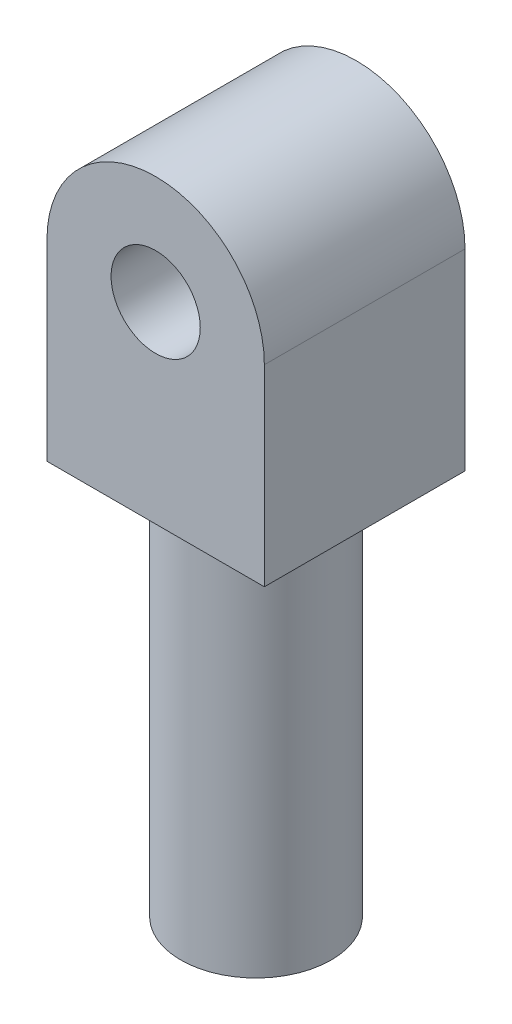
ISO-10303-21;
HEADER;
FILE_DESCRIPTION(('STEP AP214'),'2;1');
FILE_NAME('part.step','',(''),(''),'','','');
FILE_SCHEMA(('AUTOMOTIVE_DESIGN { 1 0 10303 214 1 1 1 1 }'));
ENDSEC;
DATA;
#1=APPLICATION_CONTEXT('core data for automotive mechanical design processes');
#2=APPLICATION_PROTOCOL_DEFINITION('international standard','automotive_design',2000,#1);
#3=PRODUCT_CONTEXT('',#1,'mechanical');
#4=PRODUCT('Part','Part','',(#3));
#5=PRODUCT_RELATED_PRODUCT_CATEGORY('part','',(#4));
#6=PRODUCT_DEFINITION_FORMATION('','',#4);
#7=PRODUCT_DEFINITION_CONTEXT('part definition',#1,'design');
#8=PRODUCT_DEFINITION('design','',#6,#7);
#9=PRODUCT_DEFINITION_SHAPE('','',#8);
#10=(LENGTH_UNIT() NAMED_UNIT(*) SI_UNIT(.MILLI.,.METRE.));
#11=(NAMED_UNIT(*) PLANE_ANGLE_UNIT() SI_UNIT($,.RADIAN.));
#12=(NAMED_UNIT(*) SI_UNIT($,.STERADIAN.) SOLID_ANGLE_UNIT());
#13=UNCERTAINTY_MEASURE_WITH_UNIT(LENGTH_MEASURE(1.E-05),#10,'distance_accuracy_value','');
#14=(GEOMETRIC_REPRESENTATION_CONTEXT(3) GLOBAL_UNCERTAINTY_ASSIGNED_CONTEXT((#13)) GLOBAL_UNIT_ASSIGNED_CONTEXT((#10,
#11,#12)) REPRESENTATION_CONTEXT('',''));
#15=CARTESIAN_POINT('',(0.,0.,0.));
#16=DIRECTION('',(0.,0.,1.));
#17=DIRECTION('',(1.,0.,0.));
#18=AXIS2_PLACEMENT_3D('',#15,#16,#17);
#19=CARTESIAN_POINT('',(0.,0.,18.));
#20=DIRECTION('',(0.,0.,1.));
#21=DIRECTION('',(1.,0.,0.));
#22=AXIS2_PLACEMENT_3D('',#19,#20,#21);
#23=PLANE('',#22);
#24=CARTESIAN_POINT('',(0.,0.,18.));
#25=DIRECTION('',(0.,0.,1.));
#26=DIRECTION('',(1.,0.,0.));
#27=AXIS2_PLACEMENT_3D('',#24,#25,#26);
#28=CIRCLE('',#27,9.75);
#29=CARTESIAN_POINT('',(9.75,0.,18.));
#30=VERTEX_POINT('',#29);
#31=CARTESIAN_POINT('',(-9.75,0.,18.));
#32=VERTEX_POINT('',#31);
#33=EDGE_CURVE('E93',#30,#32,#28,.T.);
#34=ORIENTED_EDGE('',*,*,#33,.T.);
#35=DIRECTION('',(0.,-1.,0.));
#36=VECTOR('',#35,1.);
#37=CARTESIAN_POINT('',(-9.75,0.,18.));
#38=LINE('',#37,#36);
#39=CARTESIAN_POINT('',(-9.75,-17.25,18.));
#40=VERTEX_POINT('',#39);
#41=EDGE_CURVE('E88',#32,#40,#38,.T.);
#42=ORIENTED_EDGE('',*,*,#41,.T.);
#43=DIRECTION('',(1.,0.,0.));
#44=VECTOR('',#43,1.);
#45=CARTESIAN_POINT('',(-9.75,-17.25,18.));
#46=LINE('',#45,#44);
#47=CARTESIAN_POINT('',(9.75,-17.25,18.));
#48=VERTEX_POINT('',#47);
#49=EDGE_CURVE('E91',#40,#48,#46,.T.);
#50=ORIENTED_EDGE('',*,*,#49,.T.);
#51=DIRECTION('',(0.,1.,0.));
#52=VECTOR('',#51,1.);
#53=CARTESIAN_POINT('',(9.75,0.,18.));
#54=LINE('',#53,#52);
#55=EDGE_CURVE('E57',#48,#30,#54,.T.);
#56=ORIENTED_EDGE('',*,*,#55,.T.);
#57=EDGE_LOOP('',(#34,#42,#50,#56));
#58=FACE_BOUND('',#57,.T.);
#59=CARTESIAN_POINT('',(0.,0.,18.));
#60=DIRECTION('',(0.,0.,1.));
#61=DIRECTION('',(1.,0.,0.));
#62=AXIS2_PLACEMENT_3D('',#59,#60,#61);
#63=CIRCLE('',#62,4.);
#64=CARTESIAN_POINT('',(4.,0.,18.));
#65=VERTEX_POINT('',#64);
#66=EDGE_CURVE('E109',#65,#65,#63,.T.);
#67=ORIENTED_EDGE('',*,*,#66,.F.);
#68=EDGE_LOOP('',(#67));
#69=FACE_BOUND('',#68,.T.);
#70=ADVANCED_FACE('F39',(#58,#69),#23,.T.);
#71=CARTESIAN_POINT('',(0.,0.,0.));
#72=DIRECTION('',(0.,0.,1.));
#73=DIRECTION('',(1.,0.,0.));
#74=AXIS2_PLACEMENT_3D('',#71,#72,#73);
#75=PLANE('',#74);
#76=CARTESIAN_POINT('',(0.,0.,0.));
#77=DIRECTION('',(0.,0.,1.));
#78=DIRECTION('',(1.,0.,0.));
#79=AXIS2_PLACEMENT_3D('',#76,#77,#78);
#80=CIRCLE('',#79,9.75);
#81=CARTESIAN_POINT('',(9.75,0.,0.));
#82=VERTEX_POINT('',#81);
#83=CARTESIAN_POINT('',(-9.75,0.,0.));
#84=VERTEX_POINT('',#83);
#85=EDGE_CURVE('E106',#82,#84,#80,.T.);
#86=ORIENTED_EDGE('',*,*,#85,.F.);
#87=DIRECTION('',(0.,1.,0.));
#88=VECTOR('',#87,1.);
#89=CARTESIAN_POINT('',(9.75,0.,0.));
#90=LINE('',#89,#88);
#91=CARTESIAN_POINT('',(9.75,-17.25,0.));
#92=VERTEX_POINT('',#91);
#93=EDGE_CURVE('E80',#92,#82,#90,.T.);
#94=ORIENTED_EDGE('',*,*,#93,.F.);
#95=DIRECTION('',(1.,0.,0.));
#96=VECTOR('',#95,1.);
#97=CARTESIAN_POINT('',(-9.75,-17.25,0.));
#98=LINE('',#97,#96);
#99=CARTESIAN_POINT('',(-9.75,-17.25,0.));
#100=VERTEX_POINT('',#99);
#101=EDGE_CURVE('E74',#100,#92,#98,.T.);
#102=ORIENTED_EDGE('',*,*,#101,.F.);
#103=DIRECTION('',(0.,-1.,0.));
#104=VECTOR('',#103,1.);
#105=CARTESIAN_POINT('',(-9.75,0.,0.));
#106=LINE('',#105,#104);
#107=EDGE_CURVE('E98',#84,#100,#106,.T.);
#108=ORIENTED_EDGE('',*,*,#107,.F.);
#109=EDGE_LOOP('',(#86,#94,#102,#108));
#110=FACE_BOUND('',#109,.T.);
#111=CARTESIAN_POINT('',(0.,0.,0.));
#112=DIRECTION('',(0.,0.,1.));
#113=DIRECTION('',(1.,0.,0.));
#114=AXIS2_PLACEMENT_3D('',#111,#112,#113);
#115=CIRCLE('',#114,4.);
#116=CARTESIAN_POINT('',(4.,0.,0.));
#117=VERTEX_POINT('',#116);
#118=EDGE_CURVE('E121',#117,#117,#115,.T.);
#119=ORIENTED_EDGE('',*,*,#118,.T.);
#120=EDGE_LOOP('',(#119));
#121=FACE_BOUND('',#120,.T.);
#122=ADVANCED_FACE('F117',(#110,#121),#75,.F.);
#123=CARTESIAN_POINT('',(0.,0.,18.));
#124=DIRECTION('',(0.,0.,-1.));
#125=DIRECTION('',(-1.,0.,0.));
#126=AXIS2_PLACEMENT_3D('',#123,#124,#125);
#127=CYLINDRICAL_SURFACE('',#126,9.75);
#128=ORIENTED_EDGE('',*,*,#85,.T.);
#129=DIRECTION('',(0.,0.,-1.));
#130=VECTOR('',#129,1.);
#131=CARTESIAN_POINT('',(-9.75,0.,18.));
#132=LINE('',#131,#130);
#133=EDGE_CURVE('E43',#32,#84,#132,.T.);
#134=ORIENTED_EDGE('',*,*,#133,.F.);
#135=ORIENTED_EDGE('',*,*,#33,.F.);
#136=DIRECTION('',(0.,0.,-1.));
#137=VECTOR('',#136,1.);
#138=CARTESIAN_POINT('',(9.75,0.,18.));
#139=LINE('',#138,#137);
#140=EDGE_CURVE('E102',#30,#82,#139,.T.);
#141=ORIENTED_EDGE('',*,*,#140,.T.);
#142=EDGE_LOOP('',(#128,#134,#135,#141));
#143=FACE_BOUND('',#142,.T.);
#144=ADVANCED_FACE('F41',(#143),#127,.T.);
#145=CARTESIAN_POINT('',(-9.75,0.,18.));
#146=DIRECTION('',(1.,0.,0.));
#147=DIRECTION('',(0.,1.,0.));
#148=AXIS2_PLACEMENT_3D('',#145,#146,#147);
#149=PLANE('',#148);
#150=ORIENTED_EDGE('',*,*,#107,.T.);
#151=DIRECTION('',(0.,0.,-1.));
#152=VECTOR('',#151,1.);
#153=CARTESIAN_POINT('',(-9.75,-17.25,18.));
#154=LINE('',#153,#152);
#155=EDGE_CURVE('E96',#40,#100,#154,.T.);
#156=ORIENTED_EDGE('',*,*,#155,.F.);
#157=ORIENTED_EDGE('',*,*,#41,.F.);
#158=ORIENTED_EDGE('',*,*,#133,.T.);
#159=EDGE_LOOP('',(#150,#156,#157,#158));
#160=FACE_BOUND('',#159,.T.);
#161=ADVANCED_FACE('F97',(#160),#149,.F.);
#162=CARTESIAN_POINT('',(-9.75,-17.25,18.));
#163=DIRECTION('',(0.,1.,0.));
#164=DIRECTION('',(-1.,0.,0.));
#165=AXIS2_PLACEMENT_3D('',#162,#163,#164);
#166=PLANE('',#165);
#167=CARTESIAN_POINT('',(0.,-17.25,9.));
#168=DIRECTION('',(0.,-1.,0.));
#169=DIRECTION('',(1.,0.,0.));
#170=AXIS2_PLACEMENT_3D('',#167,#168,#169);
#171=CIRCLE('',#170,6.75);
#172=CARTESIAN_POINT('',(6.74999999999999,-17.25,9.));
#173=VERTEX_POINT('',#172);
#174=EDGE_CURVE('E11',#173,#173,#171,.T.);
#175=ORIENTED_EDGE('',*,*,#174,.F.);
#176=EDGE_LOOP('',(#175));
#177=FACE_BOUND('',#176,.T.);
#178=ORIENTED_EDGE('',*,*,#101,.T.);
#179=DIRECTION('',(0.,0.,-1.));
#180=VECTOR('',#179,1.);
#181=CARTESIAN_POINT('',(9.75,-17.25,18.));
#182=LINE('',#181,#180);
#183=EDGE_CURVE('E99',#48,#92,#182,.T.);
#184=ORIENTED_EDGE('',*,*,#183,.F.);
#185=ORIENTED_EDGE('',*,*,#49,.F.);
#186=ORIENTED_EDGE('',*,*,#155,.T.);
#187=EDGE_LOOP('',(#178,#184,#185,#186));
#188=FACE_BOUND('',#187,.T.);
#189=ADVANCED_FACE('F100',(#177,#188),#166,.F.);
#190=CARTESIAN_POINT('',(9.75,0.,18.));
#191=DIRECTION('',(-1.,0.,0.));
#192=DIRECTION('',(0.,-1.,0.));
#193=AXIS2_PLACEMENT_3D('',#190,#191,#192);
#194=PLANE('',#193);
#195=ORIENTED_EDGE('',*,*,#93,.T.);
#196=ORIENTED_EDGE('',*,*,#140,.F.);
#197=ORIENTED_EDGE('',*,*,#55,.F.);
#198=ORIENTED_EDGE('',*,*,#183,.T.);
#199=EDGE_LOOP('',(#195,#196,#197,#198));
#200=FACE_BOUND('',#199,.T.);
#201=ADVANCED_FACE('F114',(#200),#194,.F.);
#202=CARTESIAN_POINT('',(0.,0.,18.));
#203=DIRECTION('',(0.,0.,-1.));
#204=DIRECTION('',(-1.,0.,0.));
#205=AXIS2_PLACEMENT_3D('',#202,#203,#204);
#206=CYLINDRICAL_SURFACE('',#205,4.);
#207=ORIENTED_EDGE('',*,*,#66,.T.);
#208=EDGE_LOOP('',(#207));
#209=FACE_BOUND('',#208,.T.);
#210=ORIENTED_EDGE('',*,*,#118,.F.);
#211=EDGE_LOOP('',(#210));
#212=FACE_BOUND('',#211,.T.);
#213=ADVANCED_FACE('F135',(#209,#212),#206,.F.);
#214=CARTESIAN_POINT('',(0.,-52.25,9.));
#215=DIRECTION('',(0.,1.,0.));
#216=DIRECTION('',(-1.,0.,0.));
#217=AXIS2_PLACEMENT_3D('',#214,#215,#216);
#218=CYLINDRICAL_SURFACE('',#217,6.75);
#219=CARTESIAN_POINT('',(0.,-52.25,9.));
#220=DIRECTION('',(0.,-1.,0.));
#221=DIRECTION('',(1.,0.,0.));
#222=AXIS2_PLACEMENT_3D('',#219,#220,#221);
#223=CIRCLE('',#222,6.75);
#224=CARTESIAN_POINT('',(6.74999999999998,-52.25,9.));
#225=VERTEX_POINT('',#224);
#226=EDGE_CURVE('E124',#225,#225,#223,.T.);
#227=ORIENTED_EDGE('',*,*,#226,.F.);
#228=EDGE_LOOP('',(#227));
#229=FACE_BOUND('',#228,.T.);
#230=ORIENTED_EDGE('',*,*,#174,.T.);
#231=EDGE_LOOP('',(#230));
#232=FACE_BOUND('',#231,.T.);
#233=ADVANCED_FACE('F132',(#229,#232),#218,.T.);
#234=CARTESIAN_POINT('',(0.,-52.25,9.));
#235=DIRECTION('',(0.,-1.,0.));
#236=DIRECTION('',(1.,0.,0.));
#237=AXIS2_PLACEMENT_3D('',#234,#235,#236);
#238=PLANE('',#237);
#239=ORIENTED_EDGE('',*,*,#226,.T.);
#240=EDGE_LOOP('',(#239));
#241=FACE_BOUND('',#240,.T.);
#242=ADVANCED_FACE('F130',(#241),#238,.T.);
#243=CLOSED_SHELL('',(#70,#122,#144,#161,#189,#201,#213,#233,#242));
#244=MANIFOLD_SOLID_BREP('B2',#243);
#245=ADVANCED_BREP_SHAPE_REPRESENTATION('',(#18,#244),#14);
#246=SHAPE_DEFINITION_REPRESENTATION(#9,#245);
ENDSEC;
END-ISO-10303-21;
